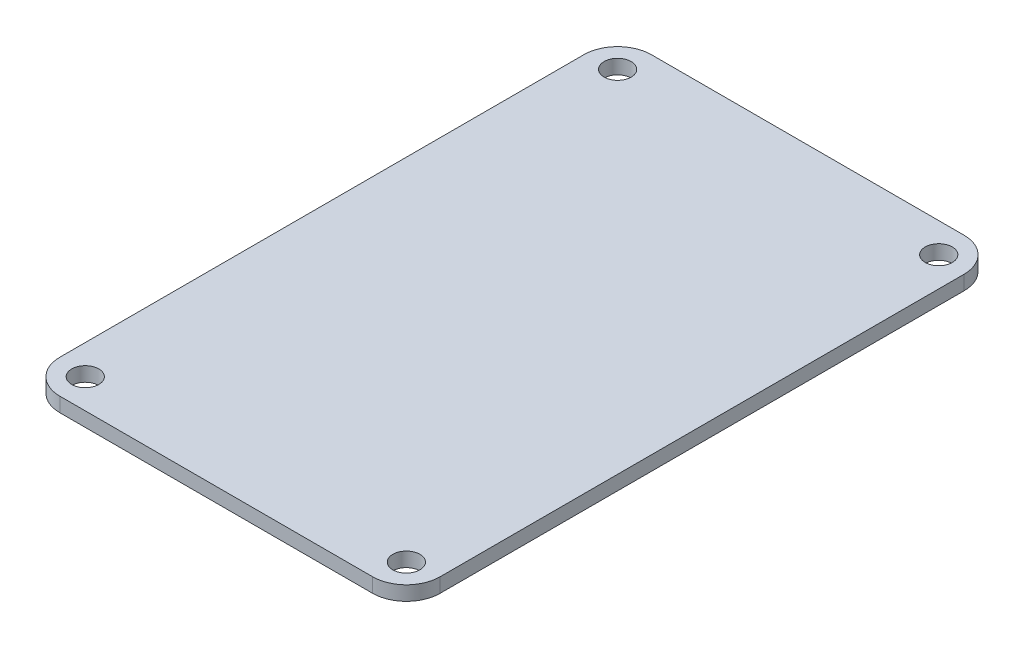
ISO-10303-21;
HEADER;
FILE_DESCRIPTION(('STEP AP214'),'2;1');
FILE_NAME('part.step','',(''),(''),'','','');
FILE_SCHEMA(('AUTOMOTIVE_DESIGN { 1 0 10303 214 1 1 1 1 }'));
ENDSEC;
DATA;
#1=APPLICATION_CONTEXT('core data for automotive mechanical design processes');
#2=APPLICATION_PROTOCOL_DEFINITION('international standard','automotive_design',2000,#1);
#3=PRODUCT_CONTEXT('',#1,'mechanical');
#4=PRODUCT('Part','Part','',(#3));
#5=PRODUCT_RELATED_PRODUCT_CATEGORY('part','',(#4));
#6=PRODUCT_DEFINITION_FORMATION('','',#4);
#7=PRODUCT_DEFINITION_CONTEXT('part definition',#1,'design');
#8=PRODUCT_DEFINITION('design','',#6,#7);
#9=PRODUCT_DEFINITION_SHAPE('','',#8);
#10=(LENGTH_UNIT() NAMED_UNIT(*) SI_UNIT(.MILLI.,.METRE.));
#11=(NAMED_UNIT(*) PLANE_ANGLE_UNIT() SI_UNIT($,.RADIAN.));
#12=(NAMED_UNIT(*) SI_UNIT($,.STERADIAN.) SOLID_ANGLE_UNIT());
#13=UNCERTAINTY_MEASURE_WITH_UNIT(LENGTH_MEASURE(1.E-05),#10,'distance_accuracy_value','');
#14=(GEOMETRIC_REPRESENTATION_CONTEXT(3) GLOBAL_UNCERTAINTY_ASSIGNED_CONTEXT((#13)) GLOBAL_UNIT_ASSIGNED_CONTEXT((#10,
#11,#12)) REPRESENTATION_CONTEXT('',''));
#15=CARTESIAN_POINT('',(0.,0.,0.));
#16=DIRECTION('',(0.,0.,1.));
#17=DIRECTION('',(1.,0.,0.));
#18=AXIS2_PLACEMENT_3D('',#15,#16,#17);
#19=CARTESIAN_POINT('',(22.5,1.7,-35.));
#20=DIRECTION('',(-1.,0.,0.));
#21=DIRECTION('',(0.,0.,1.));
#22=AXIS2_PLACEMENT_3D('',#19,#20,#21);
#23=PLANE('',#22);
#24=DIRECTION('',(0.,0.,-1.));
#25=VECTOR('',#24,1.);
#26=CARTESIAN_POINT('',(22.5,0.,-35.));
#27=LINE('',#26,#25);
#28=CARTESIAN_POINT('',(22.5,0.,31.));
#29=VERTEX_POINT('',#28);
#30=CARTESIAN_POINT('',(22.5,0.,-31.));
#31=VERTEX_POINT('',#30);
#32=EDGE_CURVE('E139',#29,#31,#27,.T.);
#33=ORIENTED_EDGE('',*,*,#32,.T.);
#34=DIRECTION('',(0.,-1.,0.));
#35=VECTOR('',#34,1.);
#36=CARTESIAN_POINT('',(22.5,1.7,-31.));
#37=LINE('',#36,#35);
#38=CARTESIAN_POINT('',(22.5,1.7,-31.));
#39=VERTEX_POINT('',#38);
#40=EDGE_CURVE('E162',#31,#39,#37,.F.);
#41=ORIENTED_EDGE('',*,*,#40,.T.);
#42=DIRECTION('',(0.,0.,-1.));
#43=VECTOR('',#42,1.);
#44=CARTESIAN_POINT('',(22.5,1.7,-35.));
#45=LINE('',#44,#43);
#46=CARTESIAN_POINT('',(22.5,1.7,31.));
#47=VERTEX_POINT('',#46);
#48=EDGE_CURVE('E137',#47,#39,#45,.T.);
#49=ORIENTED_EDGE('',*,*,#48,.F.);
#50=DIRECTION('',(0.,-1.,0.));
#51=VECTOR('',#50,1.);
#52=CARTESIAN_POINT('',(22.5,1.7,31.));
#53=LINE('',#52,#51);
#54=EDGE_CURVE('E159',#47,#29,#53,.T.);
#55=ORIENTED_EDGE('',*,*,#54,.T.);
#56=EDGE_LOOP('',(#33,#41,#49,#55));
#57=FACE_BOUND('',#56,.T.);
#58=ADVANCED_FACE('F44',(#57),#23,.F.);
#59=CARTESIAN_POINT('',(-22.5,1.7,-35.));
#60=DIRECTION('',(0.,0.,1.));
#61=DIRECTION('',(1.,0.,0.));
#62=AXIS2_PLACEMENT_3D('',#59,#60,#61);
#63=PLANE('',#62);
#64=DIRECTION('',(-1.,0.,0.));
#65=VECTOR('',#64,1.);
#66=CARTESIAN_POINT('',(-22.5,0.,-35.));
#67=LINE('',#66,#65);
#68=CARTESIAN_POINT('',(18.5,0.,-35.));
#69=VERTEX_POINT('',#68);
#70=CARTESIAN_POINT('',(-18.5,0.,-35.));
#71=VERTEX_POINT('',#70);
#72=EDGE_CURVE('E135',#69,#71,#67,.T.);
#73=ORIENTED_EDGE('',*,*,#72,.T.);
#74=DIRECTION('',(0.,-1.,0.));
#75=VECTOR('',#74,1.);
#76=CARTESIAN_POINT('',(-18.5,1.7,-35.));
#77=LINE('',#76,#75);
#78=CARTESIAN_POINT('',(-18.5,1.7,-35.));
#79=VERTEX_POINT('',#78);
#80=EDGE_CURVE('E114',#71,#79,#77,.F.);
#81=ORIENTED_EDGE('',*,*,#80,.T.);
#82=DIRECTION('',(-1.,0.,0.));
#83=VECTOR('',#82,1.);
#84=CARTESIAN_POINT('',(-22.5,1.7,-35.));
#85=LINE('',#84,#83);
#86=CARTESIAN_POINT('',(18.5,1.7,-35.));
#87=VERTEX_POINT('',#86);
#88=EDGE_CURVE('E178',#87,#79,#85,.T.);
#89=ORIENTED_EDGE('',*,*,#88,.F.);
#90=DIRECTION('',(0.,-1.,0.));
#91=VECTOR('',#90,1.);
#92=CARTESIAN_POINT('',(18.5,1.7,-35.));
#93=LINE('',#92,#91);
#94=EDGE_CURVE('E119',#87,#69,#93,.T.);
#95=ORIENTED_EDGE('',*,*,#94,.T.);
#96=EDGE_LOOP('',(#73,#81,#89,#95));
#97=FACE_BOUND('',#96,.T.);
#98=ADVANCED_FACE('F227',(#97),#63,.F.);
#99=CARTESIAN_POINT('',(-22.5,1.7,-35.));
#100=DIRECTION('',(1.,0.,0.));
#101=DIRECTION('',(0.,0.,-1.));
#102=AXIS2_PLACEMENT_3D('',#99,#100,#101);
#103=PLANE('',#102);
#104=DIRECTION('',(0.,0.,1.));
#105=VECTOR('',#104,1.);
#106=CARTESIAN_POINT('',(-22.5,1.7,-35.));
#107=LINE('',#106,#105);
#108=CARTESIAN_POINT('',(-22.5,1.7,-31.));
#109=VERTEX_POINT('',#108);
#110=CARTESIAN_POINT('',(-22.5,1.7,31.));
#111=VERTEX_POINT('',#110);
#112=EDGE_CURVE('E128',#109,#111,#107,.T.);
#113=ORIENTED_EDGE('',*,*,#112,.F.);
#114=DIRECTION('',(0.,-1.,0.));
#115=VECTOR('',#114,1.);
#116=CARTESIAN_POINT('',(-22.5,1.7,-31.));
#117=LINE('',#116,#115);
#118=CARTESIAN_POINT('',(-22.5,0.,-31.));
#119=VERTEX_POINT('',#118);
#120=EDGE_CURVE('E113',#109,#119,#117,.T.);
#121=ORIENTED_EDGE('',*,*,#120,.T.);
#122=DIRECTION('',(0.,0.,1.));
#123=VECTOR('',#122,1.);
#124=CARTESIAN_POINT('',(-22.5,0.,-35.));
#125=LINE('',#124,#123);
#126=CARTESIAN_POINT('',(-22.5,0.,31.));
#127=VERTEX_POINT('',#126);
#128=EDGE_CURVE('E126',#119,#127,#125,.T.);
#129=ORIENTED_EDGE('',*,*,#128,.T.);
#130=DIRECTION('',(0.,-1.,0.));
#131=VECTOR('',#130,1.);
#132=CARTESIAN_POINT('',(-22.5,1.7,31.));
#133=LINE('',#132,#131);
#134=EDGE_CURVE('E130',#127,#111,#133,.F.);
#135=ORIENTED_EDGE('',*,*,#134,.T.);
#136=EDGE_LOOP('',(#113,#121,#129,#135));
#137=FACE_BOUND('',#136,.T.);
#138=ADVANCED_FACE('F125',(#137),#103,.F.);
#139=CARTESIAN_POINT('',(-22.5,1.7,35.));
#140=DIRECTION('',(0.,0.,-1.));
#141=DIRECTION('',(-1.,0.,0.));
#142=AXIS2_PLACEMENT_3D('',#139,#140,#141);
#143=PLANE('',#142);
#144=DIRECTION('',(1.,0.,0.));
#145=VECTOR('',#144,1.);
#146=CARTESIAN_POINT('',(-22.5,0.,35.));
#147=LINE('',#146,#145);
#148=CARTESIAN_POINT('',(-18.5,0.,35.));
#149=VERTEX_POINT('',#148);
#150=CARTESIAN_POINT('',(18.5,0.,35.));
#151=VERTEX_POINT('',#150);
#152=EDGE_CURVE('E134',#149,#151,#147,.T.);
#153=ORIENTED_EDGE('',*,*,#152,.T.);
#154=DIRECTION('',(0.,-1.,0.));
#155=VECTOR('',#154,1.);
#156=CARTESIAN_POINT('',(18.5,1.7,35.));
#157=LINE('',#156,#155);
#158=CARTESIAN_POINT('',(18.5,1.7,35.));
#159=VERTEX_POINT('',#158);
#160=EDGE_CURVE('E13',#151,#159,#157,.F.);
#161=ORIENTED_EDGE('',*,*,#160,.T.);
#162=DIRECTION('',(1.,0.,0.));
#163=VECTOR('',#162,1.);
#164=CARTESIAN_POINT('',(-22.5,1.7,35.));
#165=LINE('',#164,#163);
#166=CARTESIAN_POINT('',(-18.5,1.7,35.));
#167=VERTEX_POINT('',#166);
#168=EDGE_CURVE('E143',#167,#159,#165,.T.);
#169=ORIENTED_EDGE('',*,*,#168,.F.);
#170=DIRECTION('',(0.,-1.,0.));
#171=VECTOR('',#170,1.);
#172=CARTESIAN_POINT('',(-18.5,1.7,35.));
#173=LINE('',#172,#171);
#174=EDGE_CURVE('E52',#167,#149,#173,.T.);
#175=ORIENTED_EDGE('',*,*,#174,.T.);
#176=EDGE_LOOP('',(#153,#161,#169,#175));
#177=FACE_BOUND('',#176,.T.);
#178=ADVANCED_FACE('F165',(#177),#143,.F.);
#179=CARTESIAN_POINT('',(0.,1.7,0.));
#180=DIRECTION('',(0.,1.,0.));
#181=DIRECTION('',(0.,0.,1.));
#182=AXIS2_PLACEMENT_3D('',#179,#180,#181);
#183=PLANE('',#182);
#184=CARTESIAN_POINT('',(19.,1.7,31.5));
#185=DIRECTION('',(0.,1.,0.));
#186=DIRECTION('',(0.,0.,1.));
#187=AXIS2_PLACEMENT_3D('',#184,#185,#186);
#188=CIRCLE('',#187,1.6);
#189=CARTESIAN_POINT('',(19.,1.7,33.1));
#190=VERTEX_POINT('',#189);
#191=EDGE_CURVE('E210',#190,#190,#188,.T.);
#192=ORIENTED_EDGE('',*,*,#191,.F.);
#193=EDGE_LOOP('',(#192));
#194=FACE_BOUND('',#193,.T.);
#195=CARTESIAN_POINT('',(-19.,1.7,31.5));
#196=DIRECTION('',(0.,1.,0.));
#197=DIRECTION('',(0.,0.,1.));
#198=AXIS2_PLACEMENT_3D('',#195,#196,#197);
#199=CIRCLE('',#198,1.6);
#200=CARTESIAN_POINT('',(-19.,1.7,33.1));
#201=VERTEX_POINT('',#200);
#202=EDGE_CURVE('E204',#201,#201,#199,.T.);
#203=ORIENTED_EDGE('',*,*,#202,.F.);
#204=EDGE_LOOP('',(#203));
#205=FACE_BOUND('',#204,.T.);
#206=CARTESIAN_POINT('',(19.,1.7,-31.5));
#207=DIRECTION('',(0.,1.,0.));
#208=DIRECTION('',(0.,0.,1.));
#209=AXIS2_PLACEMENT_3D('',#206,#207,#208);
#210=CIRCLE('',#209,1.6);
#211=CARTESIAN_POINT('',(19.,1.7,-29.9));
#212=VERTEX_POINT('',#211);
#213=EDGE_CURVE('E196',#212,#212,#210,.T.);
#214=ORIENTED_EDGE('',*,*,#213,.F.);
#215=EDGE_LOOP('',(#214));
#216=FACE_BOUND('',#215,.T.);
#217=CARTESIAN_POINT('',(-19.,1.7,-31.5));
#218=DIRECTION('',(0.,1.,0.));
#219=DIRECTION('',(0.,0.,1.));
#220=AXIS2_PLACEMENT_3D('',#217,#218,#219);
#221=CIRCLE('',#220,1.6);
#222=CARTESIAN_POINT('',(-19.,1.7,-29.9));
#223=VERTEX_POINT('',#222);
#224=EDGE_CURVE('E188',#223,#223,#221,.T.);
#225=ORIENTED_EDGE('',*,*,#224,.F.);
#226=EDGE_LOOP('',(#225));
#227=FACE_BOUND('',#226,.T.);
#228=ORIENTED_EDGE('',*,*,#88,.T.);
#229=CARTESIAN_POINT('',(-18.5,1.7,-31.));
#230=DIRECTION('',(0.,1.,0.));
#231=DIRECTION('',(0.,0.,1.));
#232=AXIS2_PLACEMENT_3D('',#229,#230,#231);
#233=CIRCLE('',#232,4.);
#234=EDGE_CURVE('E157',#79,#109,#233,.T.);
#235=ORIENTED_EDGE('',*,*,#234,.T.);
#236=ORIENTED_EDGE('',*,*,#112,.T.);
#237=CARTESIAN_POINT('',(-18.5,1.7,31.));
#238=DIRECTION('',(0.,1.,0.));
#239=DIRECTION('',(0.,0.,1.));
#240=AXIS2_PLACEMENT_3D('',#237,#238,#239);
#241=CIRCLE('',#240,4.);
#242=EDGE_CURVE('E64',#111,#167,#241,.T.);
#243=ORIENTED_EDGE('',*,*,#242,.T.);
#244=ORIENTED_EDGE('',*,*,#168,.T.);
#245=CARTESIAN_POINT('',(18.5,1.7,31.));
#246=DIRECTION('',(0.,1.,0.));
#247=DIRECTION('',(0.,0.,1.));
#248=AXIS2_PLACEMENT_3D('',#245,#246,#247);
#249=CIRCLE('',#248,4.);
#250=EDGE_CURVE('E153',#159,#47,#249,.T.);
#251=ORIENTED_EDGE('',*,*,#250,.T.);
#252=ORIENTED_EDGE('',*,*,#48,.T.);
#253=CARTESIAN_POINT('',(18.5,1.7,-31.));
#254=DIRECTION('',(0.,1.,0.));
#255=DIRECTION('',(0.,0.,1.));
#256=AXIS2_PLACEMENT_3D('',#253,#254,#255);
#257=CIRCLE('',#256,4.);
#258=EDGE_CURVE('E155',#39,#87,#257,.T.);
#259=ORIENTED_EDGE('',*,*,#258,.T.);
#260=EDGE_LOOP('',(#228,#235,#236,#243,#244,#251,#252,#259));
#261=FACE_BOUND('',#260,.T.);
#262=ADVANCED_FACE('F216',(#194,#205,#216,#227,#261),#183,.T.);
#263=CARTESIAN_POINT('',(0.,0.,0.));
#264=DIRECTION('',(0.,1.,0.));
#265=DIRECTION('',(0.,0.,1.));
#266=AXIS2_PLACEMENT_3D('',#263,#264,#265);
#267=PLANE('',#266);
#268=CARTESIAN_POINT('',(19.,0.,31.5));
#269=DIRECTION('',(0.,1.,0.));
#270=DIRECTION('',(0.,0.,1.));
#271=AXIS2_PLACEMENT_3D('',#268,#269,#270);
#272=CIRCLE('',#271,1.6);
#273=CARTESIAN_POINT('',(19.,0.,33.1));
#274=VERTEX_POINT('',#273);
#275=EDGE_CURVE('E207',#274,#274,#272,.T.);
#276=ORIENTED_EDGE('',*,*,#275,.T.);
#277=EDGE_LOOP('',(#276));
#278=FACE_BOUND('',#277,.T.);
#279=CARTESIAN_POINT('',(-19.,0.,31.5));
#280=DIRECTION('',(0.,1.,0.));
#281=DIRECTION('',(0.,0.,1.));
#282=AXIS2_PLACEMENT_3D('',#279,#280,#281);
#283=CIRCLE('',#282,1.6);
#284=CARTESIAN_POINT('',(-19.,0.,33.1));
#285=VERTEX_POINT('',#284);
#286=EDGE_CURVE('E201',#285,#285,#283,.T.);
#287=ORIENTED_EDGE('',*,*,#286,.T.);
#288=EDGE_LOOP('',(#287));
#289=FACE_BOUND('',#288,.T.);
#290=CARTESIAN_POINT('',(19.,0.,-31.5));
#291=DIRECTION('',(0.,1.,0.));
#292=DIRECTION('',(0.,0.,1.));
#293=AXIS2_PLACEMENT_3D('',#290,#291,#292);
#294=CIRCLE('',#293,1.6);
#295=CARTESIAN_POINT('',(19.,0.,-29.9));
#296=VERTEX_POINT('',#295);
#297=EDGE_CURVE('E192',#296,#296,#294,.T.);
#298=ORIENTED_EDGE('',*,*,#297,.T.);
#299=EDGE_LOOP('',(#298));
#300=FACE_BOUND('',#299,.T.);
#301=CARTESIAN_POINT('',(-19.,0.,-31.5));
#302=DIRECTION('',(0.,1.,0.));
#303=DIRECTION('',(0.,0.,1.));
#304=AXIS2_PLACEMENT_3D('',#301,#302,#303);
#305=CIRCLE('',#304,1.6);
#306=CARTESIAN_POINT('',(-19.,0.,-29.9));
#307=VERTEX_POINT('',#306);
#308=EDGE_CURVE('E183',#307,#307,#305,.T.);
#309=ORIENTED_EDGE('',*,*,#308,.T.);
#310=EDGE_LOOP('',(#309));
#311=FACE_BOUND('',#310,.T.);
#312=ORIENTED_EDGE('',*,*,#128,.F.);
#313=CARTESIAN_POINT('',(-18.5,0.,-31.));
#314=DIRECTION('',(0.,1.,0.));
#315=DIRECTION('',(0.,0.,1.));
#316=AXIS2_PLACEMENT_3D('',#313,#314,#315);
#317=CIRCLE('',#316,4.);
#318=EDGE_CURVE('E109',#119,#71,#317,.F.);
#319=ORIENTED_EDGE('',*,*,#318,.T.);
#320=ORIENTED_EDGE('',*,*,#72,.F.);
#321=CARTESIAN_POINT('',(18.5,0.,-31.));
#322=DIRECTION('',(0.,1.,0.));
#323=DIRECTION('',(0.,0.,1.));
#324=AXIS2_PLACEMENT_3D('',#321,#322,#323);
#325=CIRCLE('',#324,4.);
#326=EDGE_CURVE('E120',#69,#31,#325,.F.);
#327=ORIENTED_EDGE('',*,*,#326,.T.);
#328=ORIENTED_EDGE('',*,*,#32,.F.);
#329=CARTESIAN_POINT('',(18.5,0.,31.));
#330=DIRECTION('',(0.,1.,0.));
#331=DIRECTION('',(0.,0.,1.));
#332=AXIS2_PLACEMENT_3D('',#329,#330,#331);
#333=CIRCLE('',#332,4.);
#334=EDGE_CURVE('E146',#29,#151,#333,.F.);
#335=ORIENTED_EDGE('',*,*,#334,.T.);
#336=ORIENTED_EDGE('',*,*,#152,.F.);
#337=CARTESIAN_POINT('',(-18.5,0.,31.));
#338=DIRECTION('',(0.,1.,0.));
#339=DIRECTION('',(0.,0.,1.));
#340=AXIS2_PLACEMENT_3D('',#337,#338,#339);
#341=CIRCLE('',#340,4.);
#342=EDGE_CURVE('E129',#149,#127,#341,.F.);
#343=ORIENTED_EDGE('',*,*,#342,.T.);
#344=EDGE_LOOP('',(#312,#319,#320,#327,#328,#335,#336,#343));
#345=FACE_BOUND('',#344,.T.);
#346=ADVANCED_FACE('F132',(#278,#289,#300,#311,#345),#267,.F.);
#347=CARTESIAN_POINT('',(-19.,1.7,-31.5));
#348=DIRECTION('',(0.,1.,0.));
#349=DIRECTION('',(0.,0.,1.));
#350=AXIS2_PLACEMENT_3D('',#347,#348,#349);
#351=CYLINDRICAL_SURFACE('',#350,1.6);
#352=ORIENTED_EDGE('',*,*,#308,.F.);
#353=EDGE_LOOP('',(#352));
#354=FACE_BOUND('',#353,.T.);
#355=ORIENTED_EDGE('',*,*,#224,.T.);
#356=EDGE_LOOP('',(#355));
#357=FACE_BOUND('',#356,.T.);
#358=ADVANCED_FACE('F249',(#354,#357),#351,.F.);
#359=CARTESIAN_POINT('',(19.,1.7,-31.5));
#360=DIRECTION('',(0.,1.,0.));
#361=DIRECTION('',(0.,0.,1.));
#362=AXIS2_PLACEMENT_3D('',#359,#360,#361);
#363=CYLINDRICAL_SURFACE('',#362,1.6);
#364=ORIENTED_EDGE('',*,*,#297,.F.);
#365=EDGE_LOOP('',(#364));
#366=FACE_BOUND('',#365,.T.);
#367=ORIENTED_EDGE('',*,*,#213,.T.);
#368=EDGE_LOOP('',(#367));
#369=FACE_BOUND('',#368,.T.);
#370=ADVANCED_FACE('F254',(#366,#369),#363,.F.);
#371=CARTESIAN_POINT('',(-19.,1.7,31.5));
#372=DIRECTION('',(0.,1.,0.));
#373=DIRECTION('',(0.,0.,1.));
#374=AXIS2_PLACEMENT_3D('',#371,#372,#373);
#375=CYLINDRICAL_SURFACE('',#374,1.6);
#376=ORIENTED_EDGE('',*,*,#286,.F.);
#377=EDGE_LOOP('',(#376));
#378=FACE_BOUND('',#377,.T.);
#379=ORIENTED_EDGE('',*,*,#202,.T.);
#380=EDGE_LOOP('',(#379));
#381=FACE_BOUND('',#380,.T.);
#382=ADVANCED_FACE('F258',(#378,#381),#375,.F.);
#383=CARTESIAN_POINT('',(19.,1.7,31.5));
#384=DIRECTION('',(0.,1.,0.));
#385=DIRECTION('',(0.,0.,1.));
#386=AXIS2_PLACEMENT_3D('',#383,#384,#385);
#387=CYLINDRICAL_SURFACE('',#386,1.6);
#388=ORIENTED_EDGE('',*,*,#275,.F.);
#389=EDGE_LOOP('',(#388));
#390=FACE_BOUND('',#389,.T.);
#391=ORIENTED_EDGE('',*,*,#191,.T.);
#392=EDGE_LOOP('',(#391));
#393=FACE_BOUND('',#392,.T.);
#394=ADVANCED_FACE('F214',(#390,#393),#387,.F.);
#395=CARTESIAN_POINT('',(-18.5,1.7,-31.));
#396=DIRECTION('',(0.,-1.,0.));
#397=DIRECTION('',(0.,0.,-1.));
#398=AXIS2_PLACEMENT_3D('',#395,#396,#397);
#399=CYLINDRICAL_SURFACE('',#398,4.);
#400=ORIENTED_EDGE('',*,*,#234,.F.);
#401=ORIENTED_EDGE('',*,*,#80,.F.);
#402=ORIENTED_EDGE('',*,*,#318,.F.);
#403=ORIENTED_EDGE('',*,*,#120,.F.);
#404=EDGE_LOOP('',(#400,#401,#402,#403));
#405=FACE_BOUND('',#404,.T.);
#406=ADVANCED_FACE('F112',(#405),#399,.T.);
#407=CARTESIAN_POINT('',(18.5,1.7,-31.));
#408=DIRECTION('',(0.,-1.,0.));
#409=DIRECTION('',(0.,0.,-1.));
#410=AXIS2_PLACEMENT_3D('',#407,#408,#409);
#411=CYLINDRICAL_SURFACE('',#410,4.);
#412=ORIENTED_EDGE('',*,*,#258,.F.);
#413=ORIENTED_EDGE('',*,*,#40,.F.);
#414=ORIENTED_EDGE('',*,*,#326,.F.);
#415=ORIENTED_EDGE('',*,*,#94,.F.);
#416=EDGE_LOOP('',(#412,#413,#414,#415));
#417=FACE_BOUND('',#416,.T.);
#418=ADVANCED_FACE('F229',(#417),#411,.T.);
#419=CARTESIAN_POINT('',(18.5,1.7,31.));
#420=DIRECTION('',(0.,-1.,0.));
#421=DIRECTION('',(0.,0.,-1.));
#422=AXIS2_PLACEMENT_3D('',#419,#420,#421);
#423=CYLINDRICAL_SURFACE('',#422,4.);
#424=ORIENTED_EDGE('',*,*,#250,.F.);
#425=ORIENTED_EDGE('',*,*,#160,.F.);
#426=ORIENTED_EDGE('',*,*,#334,.F.);
#427=ORIENTED_EDGE('',*,*,#54,.F.);
#428=EDGE_LOOP('',(#424,#425,#426,#427));
#429=FACE_BOUND('',#428,.T.);
#430=ADVANCED_FACE('F172',(#429),#423,.T.);
#431=CARTESIAN_POINT('',(-18.5,1.7,31.));
#432=DIRECTION('',(0.,-1.,0.));
#433=DIRECTION('',(0.,0.,-1.));
#434=AXIS2_PLACEMENT_3D('',#431,#432,#433);
#435=CYLINDRICAL_SURFACE('',#434,4.);
#436=ORIENTED_EDGE('',*,*,#242,.F.);
#437=ORIENTED_EDGE('',*,*,#134,.F.);
#438=ORIENTED_EDGE('',*,*,#342,.F.);
#439=ORIENTED_EDGE('',*,*,#174,.F.);
#440=EDGE_LOOP('',(#436,#437,#438,#439));
#441=FACE_BOUND('',#440,.T.);
#442=ADVANCED_FACE('F46',(#441),#435,.T.);
#443=CLOSED_SHELL('',(#58,#98,#138,#178,#262,#346,#358,#370,#382,#394,#406,#418,#430,#442));
#444=MANIFOLD_SOLID_BREP('B2',#443);
#445=ADVANCED_BREP_SHAPE_REPRESENTATION('',(#18,#444),#14);
#446=SHAPE_DEFINITION_REPRESENTATION(#9,#445);
ENDSEC;
END-ISO-10303-21;
